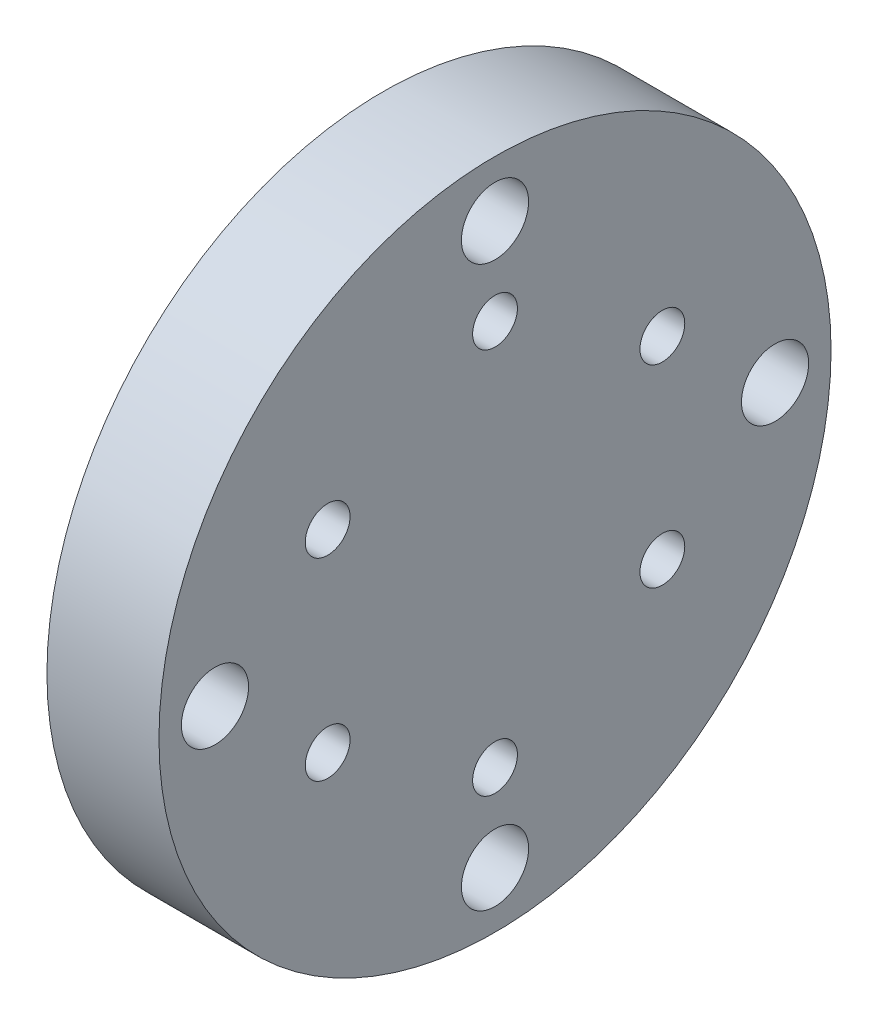
ISO-10303-21;
HEADER;
FILE_DESCRIPTION(('STEP AP214'),'2;1');
FILE_NAME('part.step','',(''),(''),'','','');
FILE_SCHEMA(('AUTOMOTIVE_DESIGN { 1 0 10303 214 1 1 1 1 }'));
ENDSEC;
DATA;
#1=APPLICATION_CONTEXT('core data for automotive mechanical design processes');
#2=APPLICATION_PROTOCOL_DEFINITION('international standard','automotive_design',2000,#1);
#3=PRODUCT_CONTEXT('',#1,'mechanical');
#4=PRODUCT('Part','Part','',(#3));
#5=PRODUCT_RELATED_PRODUCT_CATEGORY('part','',(#4));
#6=PRODUCT_DEFINITION_FORMATION('','',#4);
#7=PRODUCT_DEFINITION_CONTEXT('part definition',#1,'design');
#8=PRODUCT_DEFINITION('design','',#6,#7);
#9=PRODUCT_DEFINITION_SHAPE('','',#8);
#10=(LENGTH_UNIT() NAMED_UNIT(*) SI_UNIT(.MILLI.,.METRE.));
#11=(NAMED_UNIT(*) PLANE_ANGLE_UNIT() SI_UNIT($,.RADIAN.));
#12=(NAMED_UNIT(*) SI_UNIT($,.STERADIAN.) SOLID_ANGLE_UNIT());
#13=UNCERTAINTY_MEASURE_WITH_UNIT(LENGTH_MEASURE(1.E-05),#10,'distance_accuracy_value','');
#14=(GEOMETRIC_REPRESENTATION_CONTEXT(3) GLOBAL_UNCERTAINTY_ASSIGNED_CONTEXT((#13)) GLOBAL_UNIT_ASSIGNED_CONTEXT((#10,
#11,#12)) REPRESENTATION_CONTEXT('',''));
#15=CARTESIAN_POINT('',(0.,0.,0.));
#16=DIRECTION('',(0.,0.,1.));
#17=DIRECTION('',(1.,0.,0.));
#18=AXIS2_PLACEMENT_3D('',#15,#16,#17);
#19=CARTESIAN_POINT('',(10.,0.0481213204162113,12.8483925511272));
#20=DIRECTION('',(-1.,0.,0.));
#21=DIRECTION('',(0.,0.,1.));
#22=AXIS2_PLACEMENT_3D('',#19,#20,#21);
#23=CYLINDRICAL_SURFACE('',#22,30.);
#24=CARTESIAN_POINT('',(10.,0.0481213204162113,12.8483925511272));
#25=DIRECTION('',(1.,0.,0.));
#26=DIRECTION('',(0.,0.,-1.));
#27=AXIS2_PLACEMENT_3D('',#24,#25,#26);
#28=CIRCLE('',#27,30.);
#29=CARTESIAN_POINT('',(10.,0.0481213204162113,-17.1516074488728));
#30=VERTEX_POINT('',#29);
#31=EDGE_CURVE('E44',#30,#30,#28,.T.);
#32=ORIENTED_EDGE('',*,*,#31,.F.);
#33=EDGE_LOOP('',(#32));
#34=FACE_BOUND('',#33,.T.);
#35=CARTESIAN_POINT('',(0.,0.0481213204162113,12.8483925511272));
#36=DIRECTION('',(1.,0.,0.));
#37=DIRECTION('',(0.,0.,-1.));
#38=AXIS2_PLACEMENT_3D('',#35,#36,#37);
#39=CIRCLE('',#38,30.);
#40=CARTESIAN_POINT('',(0.,0.0481213204162113,-17.1516074488728));
#41=VERTEX_POINT('',#40);
#42=EDGE_CURVE('E79',#41,#41,#39,.T.);
#43=ORIENTED_EDGE('',*,*,#42,.T.);
#44=EDGE_LOOP('',(#43));
#45=FACE_BOUND('',#44,.T.);
#46=ADVANCED_FACE('F36',(#34,#45),#23,.T.);
#47=CARTESIAN_POINT('',(10.,-24.9518786795838,12.8483925511266));
#48=DIRECTION('',(-1.,0.,0.));
#49=DIRECTION('',(0.,0.,1.));
#50=AXIS2_PLACEMENT_3D('',#47,#48,#49);
#51=CYLINDRICAL_SURFACE('',#50,3.);
#52=CARTESIAN_POINT('',(10.,-24.9518786795838,12.8483925511266));
#53=DIRECTION('',(1.,0.,0.));
#54=DIRECTION('',(0.,0.,-1.));
#55=AXIS2_PLACEMENT_3D('',#52,#53,#54);
#56=CIRCLE('',#55,3.);
#57=CARTESIAN_POINT('',(10.,-24.9518786795838,9.84839255112665));
#58=VERTEX_POINT('',#57);
#59=EDGE_CURVE('E49',#58,#58,#56,.T.);
#60=ORIENTED_EDGE('',*,*,#59,.T.);
#61=EDGE_LOOP('',(#60));
#62=FACE_BOUND('',#61,.T.);
#63=CARTESIAN_POINT('',(0.,-24.9518786795838,12.8483925511266));
#64=DIRECTION('',(1.,0.,0.));
#65=DIRECTION('',(0.,0.,-1.));
#66=AXIS2_PLACEMENT_3D('',#63,#64,#65);
#67=CIRCLE('',#66,3.);
#68=CARTESIAN_POINT('',(0.,-24.9518786795838,9.84839255112665));
#69=VERTEX_POINT('',#68);
#70=EDGE_CURVE('E77',#69,#69,#67,.T.);
#71=ORIENTED_EDGE('',*,*,#70,.F.);
#72=EDGE_LOOP('',(#71));
#73=FACE_BOUND('',#72,.T.);
#74=ADVANCED_FACE('F115',(#62,#73),#51,.F.);
#75=CARTESIAN_POINT('',(10.,0.0481213204164763,-12.1516074488732));
#76=DIRECTION('',(-1.,0.,0.));
#77=DIRECTION('',(0.,0.,1.));
#78=AXIS2_PLACEMENT_3D('',#75,#76,#77);
#79=CYLINDRICAL_SURFACE('',#78,3.);
#80=CARTESIAN_POINT('',(10.,0.0481213204164763,-12.1516074488732));
#81=DIRECTION('',(1.,0.,0.));
#82=DIRECTION('',(0.,0.,-1.));
#83=AXIS2_PLACEMENT_3D('',#80,#81,#82);
#84=CIRCLE('',#83,3.);
#85=CARTESIAN_POINT('',(10.,0.0481213204164763,-15.1516074488732));
#86=VERTEX_POINT('',#85);
#87=EDGE_CURVE('E110',#86,#86,#84,.T.);
#88=ORIENTED_EDGE('',*,*,#87,.T.);
#89=EDGE_LOOP('',(#88));
#90=FACE_BOUND('',#89,.T.);
#91=CARTESIAN_POINT('',(0.,0.0481213204164763,-12.1516074488732));
#92=DIRECTION('',(1.,0.,0.));
#93=DIRECTION('',(0.,0.,-1.));
#94=AXIS2_PLACEMENT_3D('',#91,#92,#93);
#95=CIRCLE('',#94,3.);
#96=CARTESIAN_POINT('',(0.,0.0481213204164763,-15.1516074488732));
#97=VERTEX_POINT('',#96);
#98=EDGE_CURVE('E74',#97,#97,#95,.T.);
#99=ORIENTED_EDGE('',*,*,#98,.F.);
#100=EDGE_LOOP('',(#99));
#101=FACE_BOUND('',#100,.T.);
#102=ADVANCED_FACE('F133',(#90,#101),#79,.F.);
#103=CARTESIAN_POINT('',(10.,25.0481213204162,12.8483925511272));
#104=DIRECTION('',(-1.,0.,0.));
#105=DIRECTION('',(0.,0.,1.));
#106=AXIS2_PLACEMENT_3D('',#103,#104,#105);
#107=CYLINDRICAL_SURFACE('',#106,3.);
#108=CARTESIAN_POINT('',(10.,25.0481213204162,12.8483925511272));
#109=DIRECTION('',(1.,0.,0.));
#110=DIRECTION('',(0.,0.,-1.));
#111=AXIS2_PLACEMENT_3D('',#108,#109,#110);
#112=CIRCLE('',#111,3.);
#113=CARTESIAN_POINT('',(10.,25.0481213204162,9.84839255112717));
#114=VERTEX_POINT('',#113);
#115=EDGE_CURVE('E107',#114,#114,#112,.T.);
#116=ORIENTED_EDGE('',*,*,#115,.T.);
#117=EDGE_LOOP('',(#116));
#118=FACE_BOUND('',#117,.T.);
#119=CARTESIAN_POINT('',(0.,25.0481213204162,12.8483925511272));
#120=DIRECTION('',(1.,0.,0.));
#121=DIRECTION('',(0.,0.,-1.));
#122=AXIS2_PLACEMENT_3D('',#119,#120,#121);
#123=CIRCLE('',#122,3.);
#124=CARTESIAN_POINT('',(0.,25.0481213204162,9.84839255112717));
#125=VERTEX_POINT('',#124);
#126=EDGE_CURVE('E71',#125,#125,#123,.T.);
#127=ORIENTED_EDGE('',*,*,#126,.F.);
#128=EDGE_LOOP('',(#127));
#129=FACE_BOUND('',#128,.T.);
#130=ADVANCED_FACE('F140',(#118,#129),#107,.F.);
#131=CARTESIAN_POINT('',(10.,0.0481213204161241,37.8483925511268));
#132=DIRECTION('',(-1.,0.,0.));
#133=DIRECTION('',(0.,0.,1.));
#134=AXIS2_PLACEMENT_3D('',#131,#132,#133);
#135=CYLINDRICAL_SURFACE('',#134,3.);
#136=CARTESIAN_POINT('',(10.,0.0481213204161241,37.8483925511268));
#137=DIRECTION('',(1.,0.,0.));
#138=DIRECTION('',(0.,0.,-1.));
#139=AXIS2_PLACEMENT_3D('',#136,#137,#138);
#140=CIRCLE('',#139,3.);
#141=CARTESIAN_POINT('',(10.,0.0481213204161241,34.8483925511268));
#142=VERTEX_POINT('',#141);
#143=EDGE_CURVE('E104',#142,#142,#140,.T.);
#144=ORIENTED_EDGE('',*,*,#143,.T.);
#145=EDGE_LOOP('',(#144));
#146=FACE_BOUND('',#145,.T.);
#147=CARTESIAN_POINT('',(0.,0.0481213204161241,37.8483925511268));
#148=DIRECTION('',(1.,0.,0.));
#149=DIRECTION('',(0.,0.,-1.));
#150=AXIS2_PLACEMENT_3D('',#147,#148,#149);
#151=CIRCLE('',#150,3.);
#152=CARTESIAN_POINT('',(0.,0.0481213204161241,34.8483925511268));
#153=VERTEX_POINT('',#152);
#154=EDGE_CURVE('E68',#153,#153,#151,.T.);
#155=ORIENTED_EDGE('',*,*,#154,.F.);
#156=EDGE_LOOP('',(#155));
#157=FACE_BOUND('',#156,.T.);
#158=ADVANCED_FACE('F144',(#146,#157),#135,.F.);
#159=CARTESIAN_POINT('',(10.,-17.2018786795838,12.8483925511258));
#160=DIRECTION('',(-1.,0.,0.));
#161=DIRECTION('',(0.,0.,1.));
#162=AXIS2_PLACEMENT_3D('',#159,#160,#161);
#163=CYLINDRICAL_SURFACE('',#162,2.);
#164=CARTESIAN_POINT('',(10.,-17.2018786795838,12.8483925511258));
#165=DIRECTION('',(1.,0.,0.));
#166=DIRECTION('',(0.,0.,-1.));
#167=AXIS2_PLACEMENT_3D('',#164,#165,#166);
#168=CIRCLE('',#167,2.);
#169=CARTESIAN_POINT('',(10.,-17.2018786795838,10.8483925511258));
#170=VERTEX_POINT('',#169);
#171=EDGE_CURVE('E101',#170,#170,#168,.T.);
#172=ORIENTED_EDGE('',*,*,#171,.T.);
#173=EDGE_LOOP('',(#172));
#174=FACE_BOUND('',#173,.T.);
#175=CARTESIAN_POINT('',(0.,-17.2018786795838,12.8483925511258));
#176=DIRECTION('',(1.,0.,0.));
#177=DIRECTION('',(0.,0.,-1.));
#178=AXIS2_PLACEMENT_3D('',#175,#176,#177);
#179=CIRCLE('',#178,2.);
#180=CARTESIAN_POINT('',(0.,-17.2018786795838,10.8483925511258));
#181=VERTEX_POINT('',#180);
#182=EDGE_CURVE('E65',#181,#181,#179,.T.);
#183=ORIENTED_EDGE('',*,*,#182,.F.);
#184=EDGE_LOOP('',(#183));
#185=FACE_BOUND('',#184,.T.);
#186=ADVANCED_FACE('F148',(#174,#185),#163,.F.);
#187=CARTESIAN_POINT('',(10.,-8.57687867958323,-2.09054566415546));
#188=DIRECTION('',(-1.,0.,0.));
#189=DIRECTION('',(0.,0.,1.));
#190=AXIS2_PLACEMENT_3D('',#187,#188,#189);
#191=CYLINDRICAL_SURFACE('',#190,2.);
#192=CARTESIAN_POINT('',(10.,-8.57687867958323,-2.09054566415546));
#193=DIRECTION('',(1.,0.,0.));
#194=DIRECTION('',(0.,0.,-1.));
#195=AXIS2_PLACEMENT_3D('',#192,#193,#194);
#196=CIRCLE('',#195,2.);
#197=CARTESIAN_POINT('',(10.,-8.57687867958323,-4.09054566415546));
#198=VERTEX_POINT('',#197);
#199=EDGE_CURVE('E98',#198,#198,#196,.T.);
#200=ORIENTED_EDGE('',*,*,#199,.T.);
#201=EDGE_LOOP('',(#200));
#202=FACE_BOUND('',#201,.T.);
#203=CARTESIAN_POINT('',(0.,-8.57687867958323,-2.09054566415546));
#204=DIRECTION('',(1.,0.,0.));
#205=DIRECTION('',(0.,0.,-1.));
#206=AXIS2_PLACEMENT_3D('',#203,#204,#205);
#207=CIRCLE('',#206,2.);
#208=CARTESIAN_POINT('',(0.,-8.57687867958323,-4.09054566415546));
#209=VERTEX_POINT('',#208);
#210=EDGE_CURVE('E62',#209,#209,#207,.T.);
#211=ORIENTED_EDGE('',*,*,#210,.F.);
#212=EDGE_LOOP('',(#211));
#213=FACE_BOUND('',#212,.T.);
#214=ADVANCED_FACE('F152',(#202,#213),#191,.F.);
#215=CARTESIAN_POINT('',(10.,8.67312132041681,-2.09054566415479));
#216=DIRECTION('',(-1.,0.,0.));
#217=DIRECTION('',(0.,0.,1.));
#218=AXIS2_PLACEMENT_3D('',#215,#216,#217);
#219=CYLINDRICAL_SURFACE('',#218,2.);
#220=CARTESIAN_POINT('',(10.,8.67312132041681,-2.09054566415479));
#221=DIRECTION('',(1.,0.,0.));
#222=DIRECTION('',(0.,0.,-1.));
#223=AXIS2_PLACEMENT_3D('',#220,#221,#222);
#224=CIRCLE('',#223,2.);
#225=CARTESIAN_POINT('',(10.,8.67312132041681,-4.09054566415479));
#226=VERTEX_POINT('',#225);
#227=EDGE_CURVE('E93',#226,#226,#224,.T.);
#228=ORIENTED_EDGE('',*,*,#227,.T.);
#229=EDGE_LOOP('',(#228));
#230=FACE_BOUND('',#229,.T.);
#231=CARTESIAN_POINT('',(0.,8.67312132041681,-2.09054566415479));
#232=DIRECTION('',(1.,0.,0.));
#233=DIRECTION('',(0.,0.,-1.));
#234=AXIS2_PLACEMENT_3D('',#231,#232,#233);
#235=CIRCLE('',#234,2.);
#236=CARTESIAN_POINT('',(0.,8.67312132041681,-4.09054566415479));
#237=VERTEX_POINT('',#236);
#238=EDGE_CURVE('E59',#237,#237,#235,.T.);
#239=ORIENTED_EDGE('',*,*,#238,.F.);
#240=EDGE_LOOP('',(#239));
#241=FACE_BOUND('',#240,.T.);
#242=ADVANCED_FACE('F156',(#230,#241),#219,.F.);
#243=CARTESIAN_POINT('',(10.,17.2981213204162,12.8483925511272));
#244=DIRECTION('',(-1.,0.,0.));
#245=DIRECTION('',(0.,0.,1.));
#246=AXIS2_PLACEMENT_3D('',#243,#244,#245);
#247=CYLINDRICAL_SURFACE('',#246,2.);
#248=CARTESIAN_POINT('',(10.,17.2981213204162,12.8483925511272));
#249=DIRECTION('',(1.,0.,0.));
#250=DIRECTION('',(0.,0.,-1.));
#251=AXIS2_PLACEMENT_3D('',#248,#249,#250);
#252=CIRCLE('',#251,2.);
#253=CARTESIAN_POINT('',(10.,17.2981213204162,10.8483925511272));
#254=VERTEX_POINT('',#253);
#255=EDGE_CURVE('E88',#254,#254,#252,.T.);
#256=ORIENTED_EDGE('',*,*,#255,.T.);
#257=EDGE_LOOP('',(#256));
#258=FACE_BOUND('',#257,.T.);
#259=CARTESIAN_POINT('',(0.,17.2981213204162,12.8483925511272));
#260=DIRECTION('',(1.,0.,0.));
#261=DIRECTION('',(0.,0.,-1.));
#262=AXIS2_PLACEMENT_3D('',#259,#260,#261);
#263=CIRCLE('',#262,2.);
#264=CARTESIAN_POINT('',(0.,17.2981213204162,10.8483925511272));
#265=VERTEX_POINT('',#264);
#266=EDGE_CURVE('E56',#265,#265,#263,.T.);
#267=ORIENTED_EDGE('',*,*,#266,.F.);
#268=EDGE_LOOP('',(#267));
#269=FACE_BOUND('',#268,.T.);
#270=ADVANCED_FACE('F159',(#258,#269),#247,.F.);
#271=CARTESIAN_POINT('',(10.,8.67312132041576,27.7873307664083));
#272=DIRECTION('',(-1.,0.,0.));
#273=DIRECTION('',(0.,0.,1.));
#274=AXIS2_PLACEMENT_3D('',#271,#272,#273);
#275=CYLINDRICAL_SURFACE('',#274,2.);
#276=CARTESIAN_POINT('',(10.,8.67312132041576,27.7873307664083));
#277=DIRECTION('',(1.,0.,0.));
#278=DIRECTION('',(0.,0.,-1.));
#279=AXIS2_PLACEMENT_3D('',#276,#277,#278);
#280=CIRCLE('',#279,2.);
#281=CARTESIAN_POINT('',(10.,8.67312132041576,25.7873307664083));
#282=VERTEX_POINT('',#281);
#283=EDGE_CURVE('E84',#282,#282,#280,.T.);
#284=ORIENTED_EDGE('',*,*,#283,.T.);
#285=EDGE_LOOP('',(#284));
#286=FACE_BOUND('',#285,.T.);
#287=CARTESIAN_POINT('',(0.,8.67312132041576,27.7873307664083));
#288=DIRECTION('',(1.,0.,0.));
#289=DIRECTION('',(0.,0.,-1.));
#290=AXIS2_PLACEMENT_3D('',#287,#288,#289);
#291=CIRCLE('',#290,2.);
#292=CARTESIAN_POINT('',(0.,8.67312132041576,25.7873307664083));
#293=VERTEX_POINT('',#292);
#294=EDGE_CURVE('E53',#293,#293,#291,.T.);
#295=ORIENTED_EDGE('',*,*,#294,.F.);
#296=EDGE_LOOP('',(#295));
#297=FACE_BOUND('',#296,.T.);
#298=ADVANCED_FACE('F38',(#286,#297),#275,.F.);
#299=CARTESIAN_POINT('',(10.,-8.57687867958428,27.7873307664077));
#300=DIRECTION('',(-1.,0.,0.));
#301=DIRECTION('',(0.,0.,1.));
#302=AXIS2_PLACEMENT_3D('',#299,#300,#301);
#303=CYLINDRICAL_SURFACE('',#302,2.);
#304=CARTESIAN_POINT('',(10.,-8.57687867958428,27.7873307664077));
#305=DIRECTION('',(1.,0.,0.));
#306=DIRECTION('',(0.,0.,-1.));
#307=AXIS2_PLACEMENT_3D('',#304,#305,#306);
#308=CIRCLE('',#307,2.);
#309=CARTESIAN_POINT('',(10.,-8.57687867958428,25.7873307664077));
#310=VERTEX_POINT('',#309);
#311=EDGE_CURVE('E10',#310,#310,#308,.T.);
#312=ORIENTED_EDGE('',*,*,#311,.T.);
#313=EDGE_LOOP('',(#312));
#314=FACE_BOUND('',#313,.T.);
#315=CARTESIAN_POINT('',(0.,-8.57687867958428,27.7873307664077));
#316=DIRECTION('',(1.,0.,0.));
#317=DIRECTION('',(0.,0.,-1.));
#318=AXIS2_PLACEMENT_3D('',#315,#316,#317);
#319=CIRCLE('',#318,2.);
#320=CARTESIAN_POINT('',(0.,-8.57687867958428,25.7873307664077));
#321=VERTEX_POINT('',#320);
#322=EDGE_CURVE('E40',#321,#321,#319,.T.);
#323=ORIENTED_EDGE('',*,*,#322,.F.);
#324=EDGE_LOOP('',(#323));
#325=FACE_BOUND('',#324,.T.);
#326=ADVANCED_FACE('F122',(#314,#325),#303,.F.);
#327=CARTESIAN_POINT('',(10.,0.,0.));
#328=DIRECTION('',(1.,0.,0.));
#329=DIRECTION('',(0.,0.,-1.));
#330=AXIS2_PLACEMENT_3D('',#327,#328,#329);
#331=PLANE('',#330);
#332=ORIENTED_EDGE('',*,*,#283,.F.);
#333=EDGE_LOOP('',(#332));
#334=FACE_BOUND('',#333,.T.);
#335=ORIENTED_EDGE('',*,*,#255,.F.);
#336=EDGE_LOOP('',(#335));
#337=FACE_BOUND('',#336,.T.);
#338=ORIENTED_EDGE('',*,*,#227,.F.);
#339=EDGE_LOOP('',(#338));
#340=FACE_BOUND('',#339,.T.);
#341=ORIENTED_EDGE('',*,*,#199,.F.);
#342=EDGE_LOOP('',(#341));
#343=FACE_BOUND('',#342,.T.);
#344=ORIENTED_EDGE('',*,*,#171,.F.);
#345=EDGE_LOOP('',(#344));
#346=FACE_BOUND('',#345,.T.);
#347=ORIENTED_EDGE('',*,*,#143,.F.);
#348=EDGE_LOOP('',(#347));
#349=FACE_BOUND('',#348,.T.);
#350=ORIENTED_EDGE('',*,*,#115,.F.);
#351=EDGE_LOOP('',(#350));
#352=FACE_BOUND('',#351,.T.);
#353=ORIENTED_EDGE('',*,*,#87,.F.);
#354=EDGE_LOOP('',(#353));
#355=FACE_BOUND('',#354,.T.);
#356=ORIENTED_EDGE('',*,*,#59,.F.);
#357=EDGE_LOOP('',(#356));
#358=FACE_BOUND('',#357,.T.);
#359=ORIENTED_EDGE('',*,*,#31,.T.);
#360=EDGE_LOOP('',(#359));
#361=FACE_BOUND('',#360,.T.);
#362=ORIENTED_EDGE('',*,*,#311,.F.);
#363=EDGE_LOOP('',(#362));
#364=FACE_BOUND('',#363,.T.);
#365=ADVANCED_FACE('F118',(#334,#337,#340,#343,#346,#349,#352,#355,#358,#361,#364),#331,.T.);
#366=CARTESIAN_POINT('',(0.,0.,0.));
#367=DIRECTION('',(1.,0.,0.));
#368=DIRECTION('',(0.,0.,-1.));
#369=AXIS2_PLACEMENT_3D('',#366,#367,#368);
#370=PLANE('',#369);
#371=ORIENTED_EDGE('',*,*,#294,.T.);
#372=EDGE_LOOP('',(#371));
#373=FACE_BOUND('',#372,.T.);
#374=ORIENTED_EDGE('',*,*,#266,.T.);
#375=EDGE_LOOP('',(#374));
#376=FACE_BOUND('',#375,.T.);
#377=ORIENTED_EDGE('',*,*,#238,.T.);
#378=EDGE_LOOP('',(#377));
#379=FACE_BOUND('',#378,.T.);
#380=ORIENTED_EDGE('',*,*,#210,.T.);
#381=EDGE_LOOP('',(#380));
#382=FACE_BOUND('',#381,.T.);
#383=ORIENTED_EDGE('',*,*,#182,.T.);
#384=EDGE_LOOP('',(#383));
#385=FACE_BOUND('',#384,.T.);
#386=ORIENTED_EDGE('',*,*,#154,.T.);
#387=EDGE_LOOP('',(#386));
#388=FACE_BOUND('',#387,.T.);
#389=ORIENTED_EDGE('',*,*,#126,.T.);
#390=EDGE_LOOP('',(#389));
#391=FACE_BOUND('',#390,.T.);
#392=ORIENTED_EDGE('',*,*,#98,.T.);
#393=EDGE_LOOP('',(#392));
#394=FACE_BOUND('',#393,.T.);
#395=ORIENTED_EDGE('',*,*,#70,.T.);
#396=EDGE_LOOP('',(#395));
#397=FACE_BOUND('',#396,.T.);
#398=ORIENTED_EDGE('',*,*,#42,.F.);
#399=EDGE_LOOP('',(#398));
#400=FACE_BOUND('',#399,.T.);
#401=ORIENTED_EDGE('',*,*,#322,.T.);
#402=EDGE_LOOP('',(#401));
#403=FACE_BOUND('',#402,.T.);
#404=ADVANCED_FACE('F121',(#373,#376,#379,#382,#385,#388,#391,#394,#397,#400,#403),#370,.F.);
#405=CLOSED_SHELL('',(#46,#74,#102,#130,#158,#186,#214,#242,#270,#298,#326,#365,#404));
#406=MANIFOLD_SOLID_BREP('B2',#405);
#407=ADVANCED_BREP_SHAPE_REPRESENTATION('',(#18,#406),#14);
#408=SHAPE_DEFINITION_REPRESENTATION(#9,#407);
ENDSEC;
END-ISO-10303-21;
